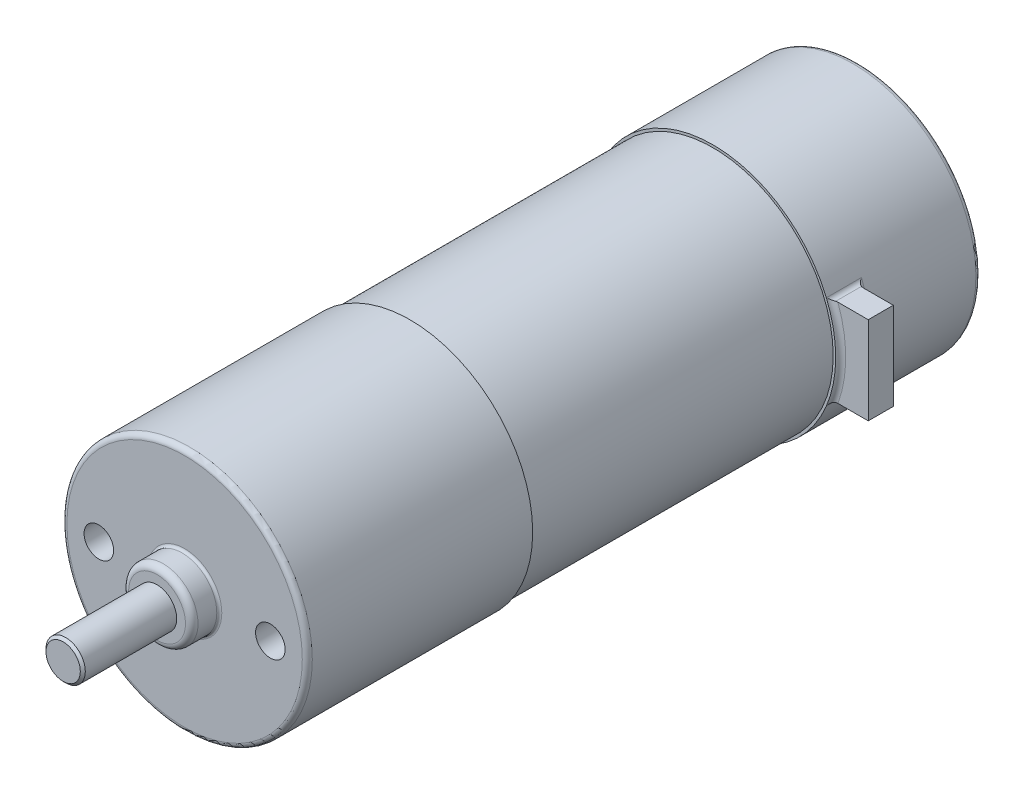
ISO-10303-21;
HEADER;
FILE_DESCRIPTION(('STEP AP214'),'2;1');
FILE_NAME('part.step','',(''),(''),'','','');
FILE_SCHEMA(('AUTOMOTIVE_DESIGN { 1 0 10303 214 1 1 1 1 }'));
ENDSEC;
DATA;
#1=APPLICATION_CONTEXT('core data for automotive mechanical design processes');
#2=APPLICATION_PROTOCOL_DEFINITION('international standard','automotive_design',2000,#1);
#3=PRODUCT_CONTEXT('',#1,'mechanical');
#4=PRODUCT('Part','Part','',(#3));
#5=PRODUCT_RELATED_PRODUCT_CATEGORY('part','',(#4));
#6=PRODUCT_DEFINITION_FORMATION('','',#4);
#7=PRODUCT_DEFINITION_CONTEXT('part definition',#1,'design');
#8=PRODUCT_DEFINITION('design','',#6,#7);
#9=PRODUCT_DEFINITION_SHAPE('','',#8);
#10=(LENGTH_UNIT() NAMED_UNIT(*) SI_UNIT(.MILLI.,.METRE.));
#11=(NAMED_UNIT(*) PLANE_ANGLE_UNIT() SI_UNIT($,.RADIAN.));
#12=(NAMED_UNIT(*) SI_UNIT($,.STERADIAN.) SOLID_ANGLE_UNIT());
#13=UNCERTAINTY_MEASURE_WITH_UNIT(LENGTH_MEASURE(1.E-05),#10,'distance_accuracy_value','');
#14=(GEOMETRIC_REPRESENTATION_CONTEXT(3) GLOBAL_UNCERTAINTY_ASSIGNED_CONTEXT((#13)) GLOBAL_UNIT_ASSIGNED_CONTEXT((#10,
#11,#12)) REPRESENTATION_CONTEXT('',''));
#15=CARTESIAN_POINT('',(0.,0.,0.));
#16=DIRECTION('',(0.,0.,1.));
#17=DIRECTION('',(1.,0.,0.));
#18=AXIS2_PLACEMENT_3D('',#15,#16,#17);
#19=CARTESIAN_POINT('',(0.,0.,-68.326));
#20=DIRECTION('',(0.,0.,1.));
#21=DIRECTION('',(-1.,0.,0.));
#22=AXIS2_PLACEMENT_3D('',#19,#20,#21);
#23=CYLINDRICAL_SURFACE('',#22,12.446);
#24=CARTESIAN_POINT('',(0.,0.,-53.594));
#25=DIRECTION('',(0.,0.,1.));
#26=DIRECTION('',(1.,0.,0.));
#27=AXIS2_PLACEMENT_3D('',#24,#25,#26);
#28=CIRCLE('',#27,12.446);
#29=CARTESIAN_POINT('',(11.5003075817149,4.75876470588235,-53.594));
#30=VERTEX_POINT('',#29);
#31=CARTESIAN_POINT('',(11.5003075817149,-4.75876470588235,-53.594));
#32=VERTEX_POINT('',#31);
#33=EDGE_CURVE('E163',#30,#32,#28,.T.);
#34=ORIENTED_EDGE('',*,*,#33,.F.);
#35=DIRECTION('',(0.,0.,1.));
#36=VECTOR('',#35,1.);
#37=CARTESIAN_POINT('',(11.5003075817149,4.75876470588235,-68.326));
#38=LINE('',#37,#36);
#39=CARTESIAN_POINT('',(11.5003075817149,4.75876470588235,-57.15));
#40=VERTEX_POINT('',#39);
#41=EDGE_CURVE('E213',#40,#30,#38,.T.);
#42=ORIENTED_EDGE('',*,*,#41,.F.);
#43=CARTESIAN_POINT('',(0.,0.,-57.15));
#44=DIRECTION('',(0.,0.,-1.));
#45=DIRECTION('',(-1.,0.,0.));
#46=AXIS2_PLACEMENT_3D('',#43,#44,#45);
#47=CIRCLE('',#46,12.446);
#48=CARTESIAN_POINT('',(11.5003075817149,-4.75876470588235,-57.15));
#49=VERTEX_POINT('',#48);
#50=EDGE_CURVE('E211',#49,#40,#47,.F.);
#51=ORIENTED_EDGE('',*,*,#50,.F.);
#52=DIRECTION('',(0.,0.,1.));
#53=VECTOR('',#52,1.);
#54=CARTESIAN_POINT('',(11.5003075817149,-4.75876470588235,-68.326));
#55=LINE('',#54,#53);
#56=EDGE_CURVE('E215',#32,#49,#55,.F.);
#57=ORIENTED_EDGE('',*,*,#56,.F.);
#58=EDGE_LOOP('',(#34,#42,#51,#57));
#59=FACE_BOUND('',#58,.T.);
#60=CARTESIAN_POINT('',(0.,0.,-67.818));
#61=DIRECTION('',(0.,0.,1.));
#62=DIRECTION('',(1.,0.,0.));
#63=AXIS2_PLACEMENT_3D('',#60,#61,#62);
#64=CIRCLE('',#63,12.446);
#65=CARTESIAN_POINT('',(12.446,0.,-67.818));
#66=VERTEX_POINT('',#65);
#67=EDGE_CURVE('E199',#66,#66,#64,.F.);
#68=ORIENTED_EDGE('',*,*,#67,.F.);
#69=EDGE_LOOP('',(#68));
#70=FACE_BOUND('',#69,.T.);
#71=ADVANCED_FACE('F45',(#59,#70),#23,.T.);
#72=CARTESIAN_POINT('',(0.,0.,-22.86));
#73=DIRECTION('',(0.,0.,1.));
#74=DIRECTION('',(-1.,0.,0.));
#75=AXIS2_PLACEMENT_3D('',#72,#73,#74);
#76=CYLINDRICAL_SURFACE('',#75,12.446);
#77=CARTESIAN_POINT('',(0.,0.,-0.508000000000002));
#78=DIRECTION('',(0.,0.,1.));
#79=DIRECTION('',(1.,0.,0.));
#80=AXIS2_PLACEMENT_3D('',#77,#78,#79);
#81=CIRCLE('',#80,12.446);
#82=CARTESIAN_POINT('',(12.446,0.,-0.508000000000002));
#83=VERTEX_POINT('',#82);
#84=EDGE_CURVE('E202',#83,#83,#81,.T.);
#85=ORIENTED_EDGE('',*,*,#84,.F.);
#86=EDGE_LOOP('',(#85));
#87=FACE_BOUND('',#86,.T.);
#88=CARTESIAN_POINT('',(0.,0.,-22.86));
#89=DIRECTION('',(0.,0.,1.));
#90=DIRECTION('',(1.,0.,0.));
#91=AXIS2_PLACEMENT_3D('',#88,#89,#90);
#92=CIRCLE('',#91,12.446);
#93=CARTESIAN_POINT('',(12.446,0.,-22.86));
#94=VERTEX_POINT('',#93);
#95=EDGE_CURVE('E170',#94,#94,#92,.T.);
#96=ORIENTED_EDGE('',*,*,#95,.T.);
#97=EDGE_LOOP('',(#96));
#98=FACE_BOUND('',#97,.T.);
#99=ADVANCED_FACE('F305',(#87,#98),#76,.T.);
#100=CARTESIAN_POINT('',(0.,0.,-22.86));
#101=DIRECTION('',(0.,0.,-1.));
#102=DIRECTION('',(1.,0.,0.));
#103=AXIS2_PLACEMENT_3D('',#100,#101,#102);
#104=PLANE('',#103);
#105=CARTESIAN_POINT('',(0.,0.,-22.86));
#106=DIRECTION('',(0.,0.,1.));
#107=DIRECTION('',(1.,0.,0.));
#108=AXIS2_PLACEMENT_3D('',#105,#106,#107);
#109=CIRCLE('',#108,12.192);
#110=CARTESIAN_POINT('',(12.192,0.,-22.86));
#111=VERTEX_POINT('',#110);
#112=EDGE_CURVE('E171',#111,#111,#109,.T.);
#113=ORIENTED_EDGE('',*,*,#112,.T.);
#114=EDGE_LOOP('',(#113));
#115=FACE_BOUND('',#114,.T.);
#116=ORIENTED_EDGE('',*,*,#95,.F.);
#117=EDGE_LOOP('',(#116));
#118=FACE_BOUND('',#117,.T.);
#119=ADVANCED_FACE('F311',(#115,#118),#104,.T.);
#120=CARTESIAN_POINT('',(0.,0.,0.));
#121=DIRECTION('',(0.,0.,-1.));
#122=DIRECTION('',(1.,0.,0.));
#123=AXIS2_PLACEMENT_3D('',#120,#121,#122);
#124=PLANE('',#123);
#125=CARTESIAN_POINT('',(8.6995,0.,0.));
#126=DIRECTION('',(0.,0.,-1.));
#127=DIRECTION('',(-1.,0.,0.));
#128=AXIS2_PLACEMENT_3D('',#125,#126,#127);
#129=CIRCLE('',#128,1.5);
#130=CARTESIAN_POINT('',(7.1995,0.,0.));
#131=VERTEX_POINT('',#130);
#132=EDGE_CURVE('E155',#131,#131,#129,.T.);
#133=ORIENTED_EDGE('',*,*,#132,.T.);
#134=EDGE_LOOP('',(#133));
#135=FACE_BOUND('',#134,.T.);
#136=CARTESIAN_POINT('',(-8.6995,0.,0.));
#137=DIRECTION('',(0.,0.,-1.));
#138=DIRECTION('',(1.,0.,0.));
#139=AXIS2_PLACEMENT_3D('',#136,#137,#138);
#140=CIRCLE('',#139,1.5);
#141=CARTESIAN_POINT('',(-10.1995,0.,0.));
#142=VERTEX_POINT('',#141);
#143=EDGE_CURVE('E158',#142,#142,#140,.T.);
#144=ORIENTED_EDGE('',*,*,#143,.T.);
#145=EDGE_LOOP('',(#144));
#146=FACE_BOUND('',#145,.T.);
#147=CARTESIAN_POINT('',(0.,0.,0.));
#148=DIRECTION('',(0.,0.,1.));
#149=DIRECTION('',(1.,0.,0.));
#150=AXIS2_PLACEMENT_3D('',#147,#148,#149);
#151=CIRCLE('',#150,11.938);
#152=CARTESIAN_POINT('',(11.938,0.,0.));
#153=VERTEX_POINT('',#152);
#154=EDGE_CURVE('E205',#153,#153,#151,.F.);
#155=ORIENTED_EDGE('',*,*,#154,.F.);
#156=EDGE_LOOP('',(#155));
#157=FACE_BOUND('',#156,.T.);
#158=CARTESIAN_POINT('',(0.,0.,0.));
#159=DIRECTION('',(0.,0.,1.));
#160=DIRECTION('',(1.,0.,0.));
#161=AXIS2_PLACEMENT_3D('',#158,#159,#160);
#162=CIRCLE('',#161,3.7719);
#163=CARTESIAN_POINT('',(3.7719,0.,0.));
#164=VERTEX_POINT('',#163);
#165=EDGE_CURVE('E193',#164,#164,#162,.T.);
#166=ORIENTED_EDGE('',*,*,#165,.F.);
#167=EDGE_LOOP('',(#166));
#168=FACE_BOUND('',#167,.T.);
#169=ADVANCED_FACE('F324',(#135,#146,#157,#168),#124,.F.);
#170=CARTESIAN_POINT('',(0.,0.,-53.594));
#171=DIRECTION('',(0.,0.,1.));
#172=DIRECTION('',(-1.,0.,0.));
#173=AXIS2_PLACEMENT_3D('',#170,#171,#172);
#174=CYLINDRICAL_SURFACE('',#173,12.192);
#175=CARTESIAN_POINT('',(0.,0.,-53.594));
#176=DIRECTION('',(0.,0.,1.));
#177=DIRECTION('',(1.,0.,0.));
#178=AXIS2_PLACEMENT_3D('',#175,#176,#177);
#179=CIRCLE('',#178,12.192);
#180=CARTESIAN_POINT('',(12.192,0.,-53.594));
#181=VERTEX_POINT('',#180);
#182=EDGE_CURVE('E166',#181,#181,#179,.T.);
#183=ORIENTED_EDGE('',*,*,#182,.T.);
#184=EDGE_LOOP('',(#183));
#185=FACE_BOUND('',#184,.T.);
#186=ORIENTED_EDGE('',*,*,#112,.F.);
#187=EDGE_LOOP('',(#186));
#188=FACE_BOUND('',#187,.T.);
#189=ADVANCED_FACE('F320',(#185,#188),#174,.T.);
#190=CARTESIAN_POINT('',(0.,0.,-68.326));
#191=DIRECTION('',(0.,0.,-1.));
#192=DIRECTION('',(1.,0.,0.));
#193=AXIS2_PLACEMENT_3D('',#190,#191,#192);
#194=PLANE('',#193);
#195=CARTESIAN_POINT('',(0.,0.,-68.326));
#196=DIRECTION('',(0.,0.,1.));
#197=DIRECTION('',(1.,0.,0.));
#198=AXIS2_PLACEMENT_3D('',#195,#196,#197);
#199=CIRCLE('',#198,11.938);
#200=CARTESIAN_POINT('',(11.938,0.,-68.326));
#201=VERTEX_POINT('',#200);
#202=EDGE_CURVE('E196',#201,#201,#199,.T.);
#203=ORIENTED_EDGE('',*,*,#202,.F.);
#204=EDGE_LOOP('',(#203));
#205=FACE_BOUND('',#204,.T.);
#206=ADVANCED_FACE('F323',(#205),#194,.T.);
#207=CARTESIAN_POINT('',(0.,0.,-53.594));
#208=DIRECTION('',(0.,0.,-1.));
#209=DIRECTION('',(1.,0.,0.));
#210=AXIS2_PLACEMENT_3D('',#207,#208,#209);
#211=PLANE('',#210);
#212=ORIENTED_EDGE('',*,*,#182,.F.);
#213=EDGE_LOOP('',(#212));
#214=FACE_BOUND('',#213,.T.);
#215=ORIENTED_EDGE('',*,*,#33,.T.);
#216=EDGE_CURVE('E167',#32,#30,#28,.T.);
#217=ORIENTED_EDGE('',*,*,#216,.T.);
#218=EDGE_LOOP('',(#215,#217));
#219=FACE_BOUND('',#218,.T.);
#220=ADVANCED_FACE('F318',(#214,#219),#211,.F.);
#221=CARTESIAN_POINT('',(0.,0.,2.794));
#222=DIRECTION('',(0.,0.,-1.));
#223=DIRECTION('',(1.,0.,0.));
#224=AXIS2_PLACEMENT_3D('',#221,#222,#223);
#225=CYLINDRICAL_SURFACE('',#224,3.5179);
#226=CARTESIAN_POINT('',(0.,0.,0.254));
#227=DIRECTION('',(0.,0.,1.));
#228=DIRECTION('',(1.,0.,0.));
#229=AXIS2_PLACEMENT_3D('',#226,#227,#228);
#230=CIRCLE('',#229,3.5179);
#231=CARTESIAN_POINT('',(3.5179,0.,0.254));
#232=VERTEX_POINT('',#231);
#233=EDGE_CURVE('E190',#232,#232,#230,.F.);
#234=ORIENTED_EDGE('',*,*,#233,.F.);
#235=EDGE_LOOP('',(#234));
#236=FACE_BOUND('',#235,.T.);
#237=CARTESIAN_POINT('',(0.,0.,2.159));
#238=DIRECTION('',(0.,0.,-1.));
#239=DIRECTION('',(-1.,0.,0.));
#240=AXIS2_PLACEMENT_3D('',#237,#238,#239);
#241=CIRCLE('',#240,3.5179);
#242=CARTESIAN_POINT('',(-3.5179,0.,2.159));
#243=VERTEX_POINT('',#242);
#244=EDGE_CURVE('E187',#243,#243,#241,.F.);
#245=ORIENTED_EDGE('',*,*,#244,.F.);
#246=EDGE_LOOP('',(#245));
#247=FACE_BOUND('',#246,.T.);
#248=ADVANCED_FACE('F370',(#236,#247),#225,.T.);
#249=CARTESIAN_POINT('',(0.,0.,2.794));
#250=DIRECTION('',(0.,0.,1.));
#251=DIRECTION('',(-1.,0.,0.));
#252=AXIS2_PLACEMENT_3D('',#249,#250,#251);
#253=PLANE('',#252);
#254=CARTESIAN_POINT('',(0.,0.,2.794));
#255=DIRECTION('',(0.,0.,-1.));
#256=DIRECTION('',(-1.,0.,0.));
#257=AXIS2_PLACEMENT_3D('',#254,#255,#256);
#258=CIRCLE('',#257,2.8829);
#259=CARTESIAN_POINT('',(-2.8829,0.,2.794));
#260=VERTEX_POINT('',#259);
#261=EDGE_CURVE('E184',#260,#260,#258,.T.);
#262=ORIENTED_EDGE('',*,*,#261,.F.);
#263=EDGE_LOOP('',(#262));
#264=FACE_BOUND('',#263,.T.);
#265=CARTESIAN_POINT('',(0.,0.,2.794));
#266=DIRECTION('',(0.,0.,-1.));
#267=DIRECTION('',(-1.,0.,0.));
#268=AXIS2_PLACEMENT_3D('',#265,#266,#267);
#269=CIRCLE('',#268,1.9939);
#270=CARTESIAN_POINT('',(1.9939,0.,2.794));
#271=VERTEX_POINT('',#270);
#272=EDGE_CURVE('E154',#271,#271,#269,.F.);
#273=ORIENTED_EDGE('',*,*,#272,.F.);
#274=EDGE_LOOP('',(#273));
#275=FACE_BOUND('',#274,.T.);
#276=ADVANCED_FACE('F373',(#264,#275),#253,.T.);
#277=CARTESIAN_POINT('',(0.,0.,12.319));
#278=DIRECTION('',(0.,0.,-1.));
#279=DIRECTION('',(1.,0.,0.));
#280=AXIS2_PLACEMENT_3D('',#277,#278,#279);
#281=CYLINDRICAL_SURFACE('',#280,1.9939);
#282=CARTESIAN_POINT('',(0.,0.,12.065));
#283=DIRECTION('',(0.,0.,-1.));
#284=DIRECTION('',(-1.,0.,0.));
#285=AXIS2_PLACEMENT_3D('',#282,#283,#284);
#286=CIRCLE('',#285,1.9939);
#287=CARTESIAN_POINT('',(1.9939,0.,12.065));
#288=VERTEX_POINT('',#287);
#289=EDGE_CURVE('E181',#288,#288,#286,.F.);
#290=CARTESIAN_POINT('',(1.9939,0.,12.065));
#291=CARTESIAN_POINT('',(1.9939,0.,11.9684270833334));
#292=CARTESIAN_POINT('',(1.9939,0.,11.8718541666667));
#293=CARTESIAN_POINT('',(1.9939,0.,11.6787083333334));
#294=CARTESIAN_POINT('',(1.9939,0.,11.5821354166667));
#295=CARTESIAN_POINT('',(1.9939,0.,11.3889895833334));
#296=CARTESIAN_POINT('',(1.9939,0.,11.2924166666667));
#297=CARTESIAN_POINT('',(1.9939,0.,11.0992708333334));
#298=CARTESIAN_POINT('',(1.9939,0.,11.0026979166667));
#299=CARTESIAN_POINT('',(1.9939,0.,10.8095520833334));
#300=CARTESIAN_POINT('',(1.9939,0.,10.7129791666667));
#301=CARTESIAN_POINT('',(1.9939,0.,10.5198333333334));
#302=CARTESIAN_POINT('',(1.9939,0.,10.4232604166667));
#303=CARTESIAN_POINT('',(1.9939,0.,10.2301145833334));
#304=CARTESIAN_POINT('',(1.9939,0.,10.1335416666667));
#305=CARTESIAN_POINT('',(1.9939,0.,9.94039583333335));
#306=CARTESIAN_POINT('',(1.9939,0.,9.84382291666669));
#307=CARTESIAN_POINT('',(1.9939,0.,9.65067708333335));
#308=CARTESIAN_POINT('',(1.9939,0.,9.55410416666668));
#309=CARTESIAN_POINT('',(1.9939,0.,9.36095833333335));
#310=CARTESIAN_POINT('',(1.9939,0.,9.26438541666668));
#311=CARTESIAN_POINT('',(1.9939,0.,9.07123958333335));
#312=CARTESIAN_POINT('',(1.9939,0.,8.97466666666668));
#313=CARTESIAN_POINT('',(1.9939,0.,8.78152083333335));
#314=CARTESIAN_POINT('',(1.9939,0.,8.68494791666668));
#315=CARTESIAN_POINT('',(1.9939,0.,8.49180208333335));
#316=CARTESIAN_POINT('',(1.9939,0.,8.39522916666668));
#317=CARTESIAN_POINT('',(1.9939,0.,8.20208333333335));
#318=CARTESIAN_POINT('',(1.9939,0.,8.10551041666668));
#319=CARTESIAN_POINT('',(1.9939,0.,7.91236458333335));
#320=CARTESIAN_POINT('',(1.9939,0.,7.81579166666668));
#321=CARTESIAN_POINT('',(1.9939,0.,7.62264583333335));
#322=CARTESIAN_POINT('',(1.9939,0.,7.52607291666668));
#323=CARTESIAN_POINT('',(1.9939,0.,7.33292708333335));
#324=CARTESIAN_POINT('',(1.9939,0.,7.23635416666668));
#325=CARTESIAN_POINT('',(1.9939,0.,7.04320833333334));
#326=CARTESIAN_POINT('',(1.9939,0.,6.94663541666668));
#327=CARTESIAN_POINT('',(1.9939,0.,6.75348958333334));
#328=CARTESIAN_POINT('',(1.9939,0.,6.65691666666668));
#329=CARTESIAN_POINT('',(1.9939,0.,6.46377083333334));
#330=CARTESIAN_POINT('',(1.9939,0.,6.36719791666668));
#331=CARTESIAN_POINT('',(1.9939,0.,6.17405208333334));
#332=CARTESIAN_POINT('',(1.9939,0.,6.07747916666668));
#333=CARTESIAN_POINT('',(1.9939,0.,5.88433333333334));
#334=CARTESIAN_POINT('',(1.9939,0.,5.78776041666667));
#335=CARTESIAN_POINT('',(1.9939,0.,5.59461458333334));
#336=CARTESIAN_POINT('',(1.9939,0.,5.49804166666667));
#337=CARTESIAN_POINT('',(1.9939,0.,5.30489583333334));
#338=CARTESIAN_POINT('',(1.9939,0.,5.20832291666667));
#339=CARTESIAN_POINT('',(1.9939,0.,5.01517708333334));
#340=CARTESIAN_POINT('',(1.9939,0.,4.91860416666667));
#341=CARTESIAN_POINT('',(1.9939,0.,4.72545833333334));
#342=CARTESIAN_POINT('',(1.9939,0.,4.62888541666667));
#343=CARTESIAN_POINT('',(1.9939,0.,4.43573958333334));
#344=CARTESIAN_POINT('',(1.9939,0.,4.33916666666667));
#345=CARTESIAN_POINT('',(1.9939,0.,4.14602083333334));
#346=CARTESIAN_POINT('',(1.9939,0.,4.04944791666667));
#347=CARTESIAN_POINT('',(1.9939,0.,3.85630208333334));
#348=CARTESIAN_POINT('',(1.9939,0.,3.75972916666667));
#349=CARTESIAN_POINT('',(1.9939,0.,3.56658333333334));
#350=CARTESIAN_POINT('',(1.9939,0.,3.47001041666667));
#351=CARTESIAN_POINT('',(1.9939,0.,3.27686458333333));
#352=CARTESIAN_POINT('',(1.9939,0.,3.18029166666667));
#353=CARTESIAN_POINT('',(1.9939,0.,2.98714583333333));
#354=CARTESIAN_POINT('',(1.9939,0.,2.89057291666667));
#355=CARTESIAN_POINT('',(1.9939,0.,2.794));
#356=B_SPLINE_CURVE_WITH_KNOTS('',3,(#290,#291,#292,#293,#294,#295,#296,#297,#298,#299,#300,
#301,#302,#303,#304,#305,#306,#307,#308,#309,#310,#311,#312,#313,#314,#315,#316,#317,#318,#319,
#320,#321,#322,#323,#324,#325,#326,#327,#328,#329,#330,#331,#332,#333,#334,#335,#336,#337,#338,
#339,#340,#341,#342,#343,#344,#345,#346,#347,#348,#349,#350,#351,#352,#353,#354,#355),
.UNSPECIFIED.,.F.,.F.,(4,2,2,2,2,2,2,2,2,2,2,2,2,2,2,2,2,2,2,2,2,2,2,2,2,2,2,2,2,2,2,2,4),(0.,
0.289718750000001,0.579437500000002,0.869156250000003,1.158875,1.44859375,1.73831250000001,
2.02803125000001,2.31775000000001,2.60746875000001,2.89718750000001,3.18690625000001,
3.47662500000001,3.76634375000001,4.05606250000001,4.34578125000001,4.63550000000001,
4.92521875000001,5.21493750000001,5.50465625000002,5.79437500000002,6.08409375000002,
6.37381250000002,6.66353125000002,6.95325000000002,7.24296875000002,7.53268750000002,
7.82240625000002,8.11212500000002,8.40184375000002,8.69156250000002,8.98128125000003,
9.27100000000003),.UNSPECIFIED.);
#357=EDGE_CURVE('BSEAM381',#288,#271,#356,.T.);
#358=ORIENTED_EDGE('',*,*,#289,.F.);
#359=ORIENTED_EDGE('',*,*,#272,.T.);
#360=ORIENTED_EDGE('',*,*,#357,.T.);
#361=ORIENTED_EDGE('',*,*,#357,.F.);
#362=EDGE_LOOP('',(#358,#360,#359,#361));
#363=FACE_BOUND('',#362,.T.);
#364=ADVANCED_FACE('F381',(#363),#281,.T.);
#365=CARTESIAN_POINT('',(0.,0.,12.319));
#366=DIRECTION('',(0.,0.,1.));
#367=DIRECTION('',(-1.,0.,0.));
#368=AXIS2_PLACEMENT_3D('',#365,#366,#367);
#369=PLANE('',#368);
#370=CARTESIAN_POINT('',(0.,0.,12.319));
#371=DIRECTION('',(0.,0.,-1.));
#372=DIRECTION('',(-1.,0.,0.));
#373=AXIS2_PLACEMENT_3D('',#370,#371,#372);
#374=CIRCLE('',#373,1.73990000000003);
#375=CARTESIAN_POINT('',(-1.73990000000003,0.,12.319));
#376=VERTEX_POINT('',#375);
#377=EDGE_CURVE('E174',#376,#376,#374,.T.);
#378=ORIENTED_EDGE('',*,*,#377,.F.);
#379=EDGE_LOOP('',(#378));
#380=FACE_BOUND('',#379,.T.);
#381=ADVANCED_FACE('F336',(#380),#369,.T.);
#382=CARTESIAN_POINT('',(0.,0.,12.319));
#383=DIRECTION('',(0.,0.,-1.));
#384=DIRECTION('',(1.,0.,0.));
#385=AXIS2_PLACEMENT_3D('',#382,#383,#384);
#386=CONICAL_SURFACE('',#385,1.73990000000003,0.785398163397436);
#387=ORIENTED_EDGE('',*,*,#289,.T.);
#388=EDGE_LOOP('',(#387));
#389=FACE_BOUND('',#388,.T.);
#390=ORIENTED_EDGE('',*,*,#377,.T.);
#391=EDGE_LOOP('',(#390));
#392=FACE_BOUND('',#391,.T.);
#393=ADVANCED_FACE('F332',(#389,#392),#386,.T.);
#394=CARTESIAN_POINT('',(0.,0.,2.159));
#395=DIRECTION('',(0.,0.,1.));
#396=DIRECTION('',(-1.,0.,0.));
#397=AXIS2_PLACEMENT_3D('',#394,#395,#396);
#398=TOROIDAL_SURFACE('',#397,2.8829,0.635);
#399=ORIENTED_EDGE('',*,*,#244,.T.);
#400=EDGE_LOOP('',(#399));
#401=FACE_BOUND('',#400,.T.);
#402=ORIENTED_EDGE('',*,*,#261,.T.);
#403=EDGE_LOOP('',(#402));
#404=FACE_BOUND('',#403,.T.);
#405=ADVANCED_FACE('F335',(#401,#404),#398,.T.);
#406=CARTESIAN_POINT('',(0.,0.,0.254));
#407=DIRECTION('',(0.,0.,-1.));
#408=DIRECTION('',(1.,0.,0.));
#409=AXIS2_PLACEMENT_3D('',#406,#407,#408);
#410=TOROIDAL_SURFACE('',#409,3.7719,0.254);
#411=ORIENTED_EDGE('',*,*,#165,.T.);
#412=EDGE_LOOP('',(#411));
#413=FACE_BOUND('',#412,.T.);
#414=ORIENTED_EDGE('',*,*,#233,.T.);
#415=EDGE_LOOP('',(#414));
#416=FACE_BOUND('',#415,.T.);
#417=ADVANCED_FACE('F340',(#413,#416),#410,.F.);
#418=CARTESIAN_POINT('',(0.,0.,-67.818));
#419=DIRECTION('',(0.,0.,-1.));
#420=DIRECTION('',(1.,0.,0.));
#421=AXIS2_PLACEMENT_3D('',#418,#419,#420);
#422=TOROIDAL_SURFACE('',#421,11.938,0.508);
#423=ORIENTED_EDGE('',*,*,#67,.T.);
#424=EDGE_LOOP('',(#423));
#425=FACE_BOUND('',#424,.T.);
#426=ORIENTED_EDGE('',*,*,#202,.T.);
#427=EDGE_LOOP('',(#426));
#428=FACE_BOUND('',#427,.T.);
#429=ADVANCED_FACE('F344',(#425,#428),#422,.T.);
#430=CARTESIAN_POINT('',(0.,0.,-0.508000000000002));
#431=DIRECTION('',(0.,0.,-1.));
#432=DIRECTION('',(1.,0.,0.));
#433=AXIS2_PLACEMENT_3D('',#430,#431,#432);
#434=TOROIDAL_SURFACE('',#433,11.938,0.508);
#435=ORIENTED_EDGE('',*,*,#154,.T.);
#436=EDGE_LOOP('',(#435));
#437=FACE_BOUND('',#436,.T.);
#438=ORIENTED_EDGE('',*,*,#84,.T.);
#439=EDGE_LOOP('',(#438));
#440=FACE_BOUND('',#439,.T.);
#441=ADVANCED_FACE('F347',(#437,#440),#434,.T.);
#442=CARTESIAN_POINT('',(-8.6995,0.,-7.62));
#443=DIRECTION('',(0.,0.,1.));
#444=DIRECTION('',(-1.,0.,0.));
#445=AXIS2_PLACEMENT_3D('',#442,#443,#444);
#446=CYLINDRICAL_SURFACE('',#445,1.5);
#447=CARTESIAN_POINT('',(-8.6995,0.,-7.62));
#448=DIRECTION('',(0.,0.,-1.));
#449=DIRECTION('',(1.,0.,0.));
#450=AXIS2_PLACEMENT_3D('',#447,#448,#449);
#451=CIRCLE('',#450,1.5);
#452=CARTESIAN_POINT('',(-10.1995,0.,-7.62));
#453=VERTEX_POINT('',#452);
#454=EDGE_CURVE('E134',#453,#453,#451,.T.);
#455=CARTESIAN_POINT('',(-10.1995,0.,-7.62));
#456=CARTESIAN_POINT('',(-10.1995,0.,-7.540625));
#457=CARTESIAN_POINT('',(-10.1995,0.,-7.46125));
#458=CARTESIAN_POINT('',(-10.1995,0.,-7.3025));
#459=CARTESIAN_POINT('',(-10.1995,0.,-7.223125));
#460=CARTESIAN_POINT('',(-10.1995,0.,-7.064375));
#461=CARTESIAN_POINT('',(-10.1995,0.,-6.985));
#462=CARTESIAN_POINT('',(-10.1995,0.,-6.82625));
#463=CARTESIAN_POINT('',(-10.1995,0.,-6.746875));
#464=CARTESIAN_POINT('',(-10.1995,0.,-6.588125));
#465=CARTESIAN_POINT('',(-10.1995,0.,-6.50875));
#466=CARTESIAN_POINT('',(-10.1995,0.,-6.35));
#467=CARTESIAN_POINT('',(-10.1995,0.,-6.270625));
#468=CARTESIAN_POINT('',(-10.1995,0.,-6.111875));
#469=CARTESIAN_POINT('',(-10.1995,0.,-6.0325));
#470=CARTESIAN_POINT('',(-10.1995,0.,-5.87375));
#471=CARTESIAN_POINT('',(-10.1995,0.,-5.794375));
#472=CARTESIAN_POINT('',(-10.1995,0.,-5.635625));
#473=CARTESIAN_POINT('',(-10.1995,0.,-5.55625));
#474=CARTESIAN_POINT('',(-10.1995,0.,-5.3975));
#475=CARTESIAN_POINT('',(-10.1995,0.,-5.318125));
#476=CARTESIAN_POINT('',(-10.1995,0.,-5.159375));
#477=CARTESIAN_POINT('',(-10.1995,0.,-5.08));
#478=CARTESIAN_POINT('',(-10.1995,0.,-4.92125));
#479=CARTESIAN_POINT('',(-10.1995,0.,-4.841875));
#480=CARTESIAN_POINT('',(-10.1995,0.,-4.683125));
#481=CARTESIAN_POINT('',(-10.1995,0.,-4.60375));
#482=CARTESIAN_POINT('',(-10.1995,0.,-4.445));
#483=CARTESIAN_POINT('',(-10.1995,0.,-4.365625));
#484=CARTESIAN_POINT('',(-10.1995,0.,-4.206875));
#485=CARTESIAN_POINT('',(-10.1995,0.,-4.1275));
#486=CARTESIAN_POINT('',(-10.1995,0.,-3.96875));
#487=CARTESIAN_POINT('',(-10.1995,0.,-3.889375));
#488=CARTESIAN_POINT('',(-10.1995,0.,-3.730625));
#489=CARTESIAN_POINT('',(-10.1995,0.,-3.65125));
#490=CARTESIAN_POINT('',(-10.1995,0.,-3.4925));
#491=CARTESIAN_POINT('',(-10.1995,0.,-3.413125));
#492=CARTESIAN_POINT('',(-10.1995,0.,-3.254375));
#493=CARTESIAN_POINT('',(-10.1995,0.,-3.175));
#494=CARTESIAN_POINT('',(-10.1995,0.,-3.01625));
#495=CARTESIAN_POINT('',(-10.1995,0.,-2.936875));
#496=CARTESIAN_POINT('',(-10.1995,0.,-2.778125));
#497=CARTESIAN_POINT('',(-10.1995,0.,-2.69875));
#498=CARTESIAN_POINT('',(-10.1995,0.,-2.54));
#499=CARTESIAN_POINT('',(-10.1995,0.,-2.460625));
#500=CARTESIAN_POINT('',(-10.1995,0.,-2.301875));
#501=CARTESIAN_POINT('',(-10.1995,0.,-2.2225));
#502=CARTESIAN_POINT('',(-10.1995,0.,-2.06375));
#503=CARTESIAN_POINT('',(-10.1995,0.,-1.984375));
#504=CARTESIAN_POINT('',(-10.1995,0.,-1.825625));
#505=CARTESIAN_POINT('',(-10.1995,0.,-1.74625));
#506=CARTESIAN_POINT('',(-10.1995,0.,-1.5875));
#507=CARTESIAN_POINT('',(-10.1995,0.,-1.508125));
#508=CARTESIAN_POINT('',(-10.1995,0.,-1.349375));
#509=CARTESIAN_POINT('',(-10.1995,0.,-1.27));
#510=CARTESIAN_POINT('',(-10.1995,0.,-1.11125));
#511=CARTESIAN_POINT('',(-10.1995,0.,-1.031875));
#512=CARTESIAN_POINT('',(-10.1995,0.,-0.873125));
#513=CARTESIAN_POINT('',(-10.1995,0.,-0.79375));
#514=CARTESIAN_POINT('',(-10.1995,0.,-0.635));
#515=CARTESIAN_POINT('',(-10.1995,0.,-0.555625));
#516=CARTESIAN_POINT('',(-10.1995,0.,-0.396875));
#517=CARTESIAN_POINT('',(-10.1995,0.,-0.3175));
#518=CARTESIAN_POINT('',(-10.1995,0.,-0.15875));
#519=CARTESIAN_POINT('',(-10.1995,0.,-0.0793749999999999));
#520=CARTESIAN_POINT('',(-10.1995,0.,0.));
#521=B_SPLINE_CURVE_WITH_KNOTS('',3,(#455,#456,#457,#458,#459,#460,#461,#462,#463,#464,#465,
#466,#467,#468,#469,#470,#471,#472,#473,#474,#475,#476,#477,#478,#479,#480,#481,#482,#483,#484,
#485,#486,#487,#488,#489,#490,#491,#492,#493,#494,#495,#496,#497,#498,#499,#500,#501,#502,#503,
#504,#505,#506,#507,#508,#509,#510,#511,#512,#513,#514,#515,#516,#517,#518,#519,#520),
.UNSPECIFIED.,.F.,.F.,(4,2,2,2,2,2,2,2,2,2,2,2,2,2,2,2,2,2,2,2,2,2,2,2,2,2,2,2,2,2,2,2,4),(0.,
0.238125,0.476249999999999,0.714375,0.952499999999999,1.190625,1.42875,1.666875,1.905,2.143125,
2.38125,2.619375,2.8575,3.095625,3.33375,3.571875,3.81,4.048125,4.28625,4.524375,4.7625,
5.000625,5.23875,5.476875,5.715,5.953125,6.19125,6.429375,6.6675,6.905625,7.14375,7.381875,
7.62),.UNSPECIFIED.);
#522=EDGE_CURVE('BSEAM350',#453,#142,#521,.T.);
#523=ORIENTED_EDGE('',*,*,#454,.T.);
#524=ORIENTED_EDGE('',*,*,#143,.F.);
#525=ORIENTED_EDGE('',*,*,#522,.T.);
#526=ORIENTED_EDGE('',*,*,#522,.F.);
#527=EDGE_LOOP('',(#523,#525,#524,#526));
#528=FACE_BOUND('',#527,.T.);
#529=ADVANCED_FACE('F350',(#528),#446,.F.);
#530=CARTESIAN_POINT('',(-8.6995,0.,-7.62));
#531=DIRECTION('',(0.,0.,-1.));
#532=DIRECTION('',(1.,0.,0.));
#533=AXIS2_PLACEMENT_3D('',#530,#531,#532);
#534=PLANE('',#533);
#535=ORIENTED_EDGE('',*,*,#454,.F.);
#536=EDGE_LOOP('',(#535));
#537=FACE_BOUND('',#536,.T.);
#538=ADVANCED_FACE('F355',(#537),#534,.F.);
#539=CARTESIAN_POINT('',(8.6995,0.,-7.62));
#540=DIRECTION('',(0.,0.,1.));
#541=DIRECTION('',(-1.,0.,0.));
#542=AXIS2_PLACEMENT_3D('',#539,#540,#541);
#543=CYLINDRICAL_SURFACE('',#542,1.5);
#544=CARTESIAN_POINT('',(8.6995,0.,-7.62));
#545=DIRECTION('',(0.,0.,-1.));
#546=DIRECTION('',(-1.,0.,0.));
#547=AXIS2_PLACEMENT_3D('',#544,#545,#546);
#548=CIRCLE('',#547,1.5);
#549=CARTESIAN_POINT('',(7.1995,0.,-7.62));
#550=VERTEX_POINT('',#549);
#551=EDGE_CURVE('E151',#550,#550,#548,.T.);
#552=CARTESIAN_POINT('',(7.1995,0.,-7.62));
#553=CARTESIAN_POINT('',(7.1995,0.,-7.540625));
#554=CARTESIAN_POINT('',(7.1995,0.,-7.46125));
#555=CARTESIAN_POINT('',(7.1995,0.,-7.3025));
#556=CARTESIAN_POINT('',(7.1995,0.,-7.223125));
#557=CARTESIAN_POINT('',(7.1995,0.,-7.064375));
#558=CARTESIAN_POINT('',(7.1995,0.,-6.985));
#559=CARTESIAN_POINT('',(7.1995,0.,-6.82625));
#560=CARTESIAN_POINT('',(7.1995,0.,-6.746875));
#561=CARTESIAN_POINT('',(7.1995,0.,-6.588125));
#562=CARTESIAN_POINT('',(7.1995,0.,-6.50875));
#563=CARTESIAN_POINT('',(7.1995,0.,-6.35));
#564=CARTESIAN_POINT('',(7.1995,0.,-6.270625));
#565=CARTESIAN_POINT('',(7.1995,0.,-6.111875));
#566=CARTESIAN_POINT('',(7.1995,0.,-6.0325));
#567=CARTESIAN_POINT('',(7.1995,0.,-5.87375));
#568=CARTESIAN_POINT('',(7.1995,0.,-5.794375));
#569=CARTESIAN_POINT('',(7.1995,0.,-5.635625));
#570=CARTESIAN_POINT('',(7.1995,0.,-5.55625));
#571=CARTESIAN_POINT('',(7.1995,0.,-5.3975));
#572=CARTESIAN_POINT('',(7.1995,0.,-5.318125));
#573=CARTESIAN_POINT('',(7.1995,0.,-5.159375));
#574=CARTESIAN_POINT('',(7.1995,0.,-5.08));
#575=CARTESIAN_POINT('',(7.1995,0.,-4.92125));
#576=CARTESIAN_POINT('',(7.1995,0.,-4.841875));
#577=CARTESIAN_POINT('',(7.1995,0.,-4.683125));
#578=CARTESIAN_POINT('',(7.1995,0.,-4.60375));
#579=CARTESIAN_POINT('',(7.1995,0.,-4.445));
#580=CARTESIAN_POINT('',(7.1995,0.,-4.365625));
#581=CARTESIAN_POINT('',(7.1995,0.,-4.206875));
#582=CARTESIAN_POINT('',(7.1995,0.,-4.1275));
#583=CARTESIAN_POINT('',(7.1995,0.,-3.96875));
#584=CARTESIAN_POINT('',(7.1995,0.,-3.889375));
#585=CARTESIAN_POINT('',(7.1995,0.,-3.730625));
#586=CARTESIAN_POINT('',(7.1995,0.,-3.65125));
#587=CARTESIAN_POINT('',(7.1995,0.,-3.4925));
#588=CARTESIAN_POINT('',(7.1995,0.,-3.413125));
#589=CARTESIAN_POINT('',(7.1995,0.,-3.254375));
#590=CARTESIAN_POINT('',(7.1995,0.,-3.175));
#591=CARTESIAN_POINT('',(7.1995,0.,-3.01625));
#592=CARTESIAN_POINT('',(7.1995,0.,-2.936875));
#593=CARTESIAN_POINT('',(7.1995,0.,-2.778125));
#594=CARTESIAN_POINT('',(7.1995,0.,-2.69875));
#595=CARTESIAN_POINT('',(7.1995,0.,-2.54));
#596=CARTESIAN_POINT('',(7.1995,0.,-2.460625));
#597=CARTESIAN_POINT('',(7.1995,0.,-2.301875));
#598=CARTESIAN_POINT('',(7.1995,0.,-2.2225));
#599=CARTESIAN_POINT('',(7.1995,0.,-2.06375));
#600=CARTESIAN_POINT('',(7.1995,0.,-1.984375));
#601=CARTESIAN_POINT('',(7.1995,0.,-1.825625));
#602=CARTESIAN_POINT('',(7.1995,0.,-1.74625));
#603=CARTESIAN_POINT('',(7.1995,0.,-1.5875));
#604=CARTESIAN_POINT('',(7.1995,0.,-1.508125));
#605=CARTESIAN_POINT('',(7.1995,0.,-1.349375));
#606=CARTESIAN_POINT('',(7.1995,0.,-1.27));
#607=CARTESIAN_POINT('',(7.1995,0.,-1.11125));
#608=CARTESIAN_POINT('',(7.1995,0.,-1.031875));
#609=CARTESIAN_POINT('',(7.1995,0.,-0.873125));
#610=CARTESIAN_POINT('',(7.1995,0.,-0.79375));
#611=CARTESIAN_POINT('',(7.1995,0.,-0.635));
#612=CARTESIAN_POINT('',(7.1995,0.,-0.555625));
#613=CARTESIAN_POINT('',(7.1995,0.,-0.396875));
#614=CARTESIAN_POINT('',(7.1995,0.,-0.3175));
#615=CARTESIAN_POINT('',(7.1995,0.,-0.15875));
#616=CARTESIAN_POINT('',(7.1995,0.,-0.0793749999999999));
#617=CARTESIAN_POINT('',(7.1995,0.,0.));
#618=B_SPLINE_CURVE_WITH_KNOTS('',3,(#552,#553,#554,#555,#556,#557,#558,#559,#560,#561,#562,
#563,#564,#565,#566,#567,#568,#569,#570,#571,#572,#573,#574,#575,#576,#577,#578,#579,#580,#581,
#582,#583,#584,#585,#586,#587,#588,#589,#590,#591,#592,#593,#594,#595,#596,#597,#598,#599,#600,
#601,#602,#603,#604,#605,#606,#607,#608,#609,#610,#611,#612,#613,#614,#615,#616,#617),
.UNSPECIFIED.,.F.,.F.,(4,2,2,2,2,2,2,2,2,2,2,2,2,2,2,2,2,2,2,2,2,2,2,2,2,2,2,2,2,2,2,2,4),(0.,
0.238125,0.476249999999999,0.714375,0.952499999999999,1.190625,1.42875,1.666875,1.905,2.143125,
2.38125,2.619375,2.8575,3.095625,3.33375,3.571875,3.81,4.048125,4.28625,4.524375,4.7625,
5.000625,5.23875,5.476875,5.715,5.953125,6.19125,6.429375,6.6675,6.905625,7.14375,7.381875,
7.62),.UNSPECIFIED.);
#619=EDGE_CURVE('BSEAM451',#550,#131,#618,.T.);
#620=ORIENTED_EDGE('',*,*,#551,.T.);
#621=ORIENTED_EDGE('',*,*,#132,.F.);
#622=ORIENTED_EDGE('',*,*,#619,.T.);
#623=ORIENTED_EDGE('',*,*,#619,.F.);
#624=EDGE_LOOP('',(#620,#622,#621,#623));
#625=FACE_BOUND('',#624,.T.);
#626=ADVANCED_FACE('F451',(#625),#543,.F.);
#627=CARTESIAN_POINT('',(8.6995,0.,-7.62));
#628=DIRECTION('',(0.,0.,1.));
#629=DIRECTION('',(-1.,0.,0.));
#630=AXIS2_PLACEMENT_3D('',#627,#628,#629);
#631=PLANE('',#630);
#632=ORIENTED_EDGE('',*,*,#551,.F.);
#633=EDGE_LOOP('',(#632));
#634=FACE_BOUND('',#633,.T.);
#635=ADVANCED_FACE('F248',(#634),#631,.T.);
#636=CARTESIAN_POINT('',(15.24,4.445,-56.642));
#637=DIRECTION('',(0.,-1.,0.));
#638=DIRECTION('',(0.,0.,1.));
#639=AXIS2_PLACEMENT_3D('',#636,#637,#638);
#640=PLANE('',#639);
#641=CARTESIAN_POINT('',(12.1675014279843,4.445,-54.102));
#642=CARTESIAN_POINT('',(12.1338096494499,4.445,-54.1020082594795));
#643=CARTESIAN_POINT('',(12.1001655613649,4.445,-54.0990415470574));
#644=CARTESIAN_POINT('',(12.0505457348276,4.445,-54.0902431488967));
#645=CARTESIAN_POINT('',(12.03417005634,4.445,-54.08659408182));
#646=CARTESIAN_POINT('',(12.0016779644083,4.445,-54.0778357234633));
#647=CARTESIAN_POINT('',(11.9855645429467,4.445,-54.072715337041));
#648=CARTESIAN_POINT('',(11.9697078911726,4.445,-54.0668795735051));
#649=B_SPLINE_CURVE_WITH_KNOTS('',3,(#641,#642,#643,#644,#645,#646,#647,#648),.UNSPECIFIED.,.F.,
.F.,(4,2,2,4),(0.,0.100835063375725,0.15110652724218,0.201767508163891),.UNSPECIFIED.);
#650=CARTESIAN_POINT('',(12.1675014279843,4.445,-54.102));
#651=VERTEX_POINT('',#650);
#652=CARTESIAN_POINT('',(11.9697078911726,4.445,-54.0668795735051));
#653=VERTEX_POINT('',#652);
#654=EDGE_CURVE('E223',#651,#653,#649,.T.);
#655=ORIENTED_EDGE('',*,*,#654,.F.);
#656=DIRECTION('',(-1.,0.,0.));
#657=VECTOR('',#656,1.);
#658=CARTESIAN_POINT('',(15.24,4.445,-54.102));
#659=LINE('',#658,#657);
#660=CARTESIAN_POINT('',(15.24,4.445,-54.102));
#661=VERTEX_POINT('',#660);
#662=EDGE_CURVE('E140',#661,#651,#659,.T.);
#663=ORIENTED_EDGE('',*,*,#662,.F.);
#664=DIRECTION('',(0.,0.,-1.));
#665=VECTOR('',#664,1.);
#666=CARTESIAN_POINT('',(15.24,4.445,-56.642));
#667=LINE('',#666,#665);
#668=CARTESIAN_POINT('',(15.24,4.445,-56.642));
#669=VERTEX_POINT('',#668);
#670=EDGE_CURVE('E120',#661,#669,#667,.T.);
#671=ORIENTED_EDGE('',*,*,#670,.T.);
#672=DIRECTION('',(-1.,0.,0.));
#673=VECTOR('',#672,1.);
#674=CARTESIAN_POINT('',(15.24,4.445,-56.642));
#675=LINE('',#674,#673);
#676=CARTESIAN_POINT('',(12.1675014279843,4.445,-56.642));
#677=VERTEX_POINT('',#676);
#678=EDGE_CURVE('E129',#669,#677,#675,.T.);
#679=ORIENTED_EDGE('',*,*,#678,.T.);
#680=CARTESIAN_POINT('',(11.9697078911726,4.445,-56.6771204264949));
#681=CARTESIAN_POINT('',(11.9855645429467,4.445,-56.671284662959));
#682=CARTESIAN_POINT('',(12.0016779644083,4.445,-56.6661642765367));
#683=CARTESIAN_POINT('',(12.03417005634,4.445,-56.65740591818));
#684=CARTESIAN_POINT('',(12.0505457348276,4.445,-56.6537568511033));
#685=CARTESIAN_POINT('',(12.1001655613649,4.445,-56.6449584529426));
#686=CARTESIAN_POINT('',(12.1338096494499,4.445,-56.6419917405205));
#687=CARTESIAN_POINT('',(12.1675014279843,4.445,-56.642));
#688=B_SPLINE_CURVE_WITH_KNOTS('',3,(#680,#681,#682,#683,#684,#685,#686,#687),.UNSPECIFIED.,.F.,
.F.,(4,2,2,4),(0.,0.0506609809217117,0.100932444788166,0.201767508163893),.UNSPECIFIED.);
#689=CARTESIAN_POINT('',(11.9697078911726,4.445,-56.6771204264949));
#690=VERTEX_POINT('',#689);
#691=EDGE_CURVE('E11',#690,#677,#688,.T.);
#692=ORIENTED_EDGE('',*,*,#691,.F.);
#693=DIRECTION('',(0.,0.,-1.));
#694=VECTOR('',#693,1.);
#695=CARTESIAN_POINT('',(11.9697078911726,4.445,-56.642));
#696=LINE('',#695,#694);
#697=EDGE_CURVE('E220',#653,#690,#696,.T.);
#698=ORIENTED_EDGE('',*,*,#697,.F.);
#699=EDGE_LOOP('',(#655,#663,#671,#679,#692,#698));
#700=FACE_BOUND('',#699,.T.);
#701=ADVANCED_FACE('F138',(#700),#640,.F.);
#702=CARTESIAN_POINT('',(15.24,-4.445,-54.102));
#703=DIRECTION('',(0.,1.,0.));
#704=DIRECTION('',(0.,0.,-1.));
#705=AXIS2_PLACEMENT_3D('',#702,#703,#704);
#706=PLANE('',#705);
#707=DIRECTION('',(-1.,0.,0.));
#708=VECTOR('',#707,1.);
#709=CARTESIAN_POINT('',(15.24,-4.445,-56.642));
#710=LINE('',#709,#708);
#711=CARTESIAN_POINT('',(15.24,-4.445,-56.642));
#712=VERTEX_POINT('',#711);
#713=CARTESIAN_POINT('',(12.1675014279843,-4.445,-56.642));
#714=VERTEX_POINT('',#713);
#715=EDGE_CURVE('E135',#712,#714,#710,.T.);
#716=ORIENTED_EDGE('',*,*,#715,.F.);
#717=DIRECTION('',(0.,0.,1.));
#718=VECTOR('',#717,1.);
#719=CARTESIAN_POINT('',(15.24,-4.445,-54.102));
#720=LINE('',#719,#718);
#721=CARTESIAN_POINT('',(15.24,-4.445,-54.102));
#722=VERTEX_POINT('',#721);
#723=EDGE_CURVE('E123',#712,#722,#720,.T.);
#724=ORIENTED_EDGE('',*,*,#723,.T.);
#725=DIRECTION('',(-1.,0.,0.));
#726=VECTOR('',#725,1.);
#727=CARTESIAN_POINT('',(15.24,-4.445,-54.102));
#728=LINE('',#727,#726);
#729=CARTESIAN_POINT('',(12.1675014279843,-4.445,-54.102));
#730=VERTEX_POINT('',#729);
#731=EDGE_CURVE('E147',#722,#730,#728,.T.);
#732=ORIENTED_EDGE('',*,*,#731,.T.);
#733=CARTESIAN_POINT('',(11.9697078911726,-4.445,-54.0668795735051));
#734=CARTESIAN_POINT('',(11.9855645429467,-4.445,-54.072715337041));
#735=CARTESIAN_POINT('',(12.0016779644083,-4.445,-54.0778357234633));
#736=CARTESIAN_POINT('',(12.03417005634,-4.445,-54.08659408182));
#737=CARTESIAN_POINT('',(12.0505457348276,-4.445,-54.0902431488967));
#738=CARTESIAN_POINT('',(12.1001655613649,-4.445,-54.0990415470574));
#739=CARTESIAN_POINT('',(12.1338096494499,-4.445,-54.1020082594795));
#740=CARTESIAN_POINT('',(12.1675014279843,-4.445,-54.102));
#741=B_SPLINE_CURVE_WITH_KNOTS('',3,(#733,#734,#735,#736,#737,#738,#739,#740),.UNSPECIFIED.,.F.,
.F.,(4,2,2,4),(0.,0.0506609809217133,0.100932444788166,0.201767508163893),.UNSPECIFIED.);
#742=CARTESIAN_POINT('',(11.9697078911726,-4.445,-54.0668795735051));
#743=VERTEX_POINT('',#742);
#744=EDGE_CURVE('E232',#743,#730,#741,.T.);
#745=ORIENTED_EDGE('',*,*,#744,.F.);
#746=DIRECTION('',(0.,0.,-1.));
#747=VECTOR('',#746,1.);
#748=CARTESIAN_POINT('',(11.9697078911726,-4.445,-54.102));
#749=LINE('',#748,#747);
#750=CARTESIAN_POINT('',(11.9697078911726,-4.445,-56.6771204264949));
#751=VERTEX_POINT('',#750);
#752=EDGE_CURVE('E208',#751,#743,#749,.F.);
#753=ORIENTED_EDGE('',*,*,#752,.F.);
#754=CARTESIAN_POINT('',(12.1675014279843,-4.445,-56.642));
#755=CARTESIAN_POINT('',(12.1338096494499,-4.445,-56.6419917405205));
#756=CARTESIAN_POINT('',(12.1001655613649,-4.445,-56.6449584529426));
#757=CARTESIAN_POINT('',(12.0505457348276,-4.445,-56.6537568511033));
#758=CARTESIAN_POINT('',(12.03417005634,-4.445,-56.65740591818));
#759=CARTESIAN_POINT('',(12.0016779644083,-4.445,-56.6661642765367));
#760=CARTESIAN_POINT('',(11.9855645429467,-4.445,-56.671284662959));
#761=CARTESIAN_POINT('',(11.9697078911726,-4.445,-56.6771204264949));
#762=B_SPLINE_CURVE_WITH_KNOTS('',3,(#754,#755,#756,#757,#758,#759,#760,#761),.UNSPECIFIED.,.F.,
.F.,(4,2,2,4),(0.,0.100835063375725,0.15110652724218,0.201767508163891),.UNSPECIFIED.);
#763=EDGE_CURVE('E59',#714,#751,#762,.T.);
#764=ORIENTED_EDGE('',*,*,#763,.F.);
#765=EDGE_LOOP('',(#716,#724,#732,#745,#753,#764));
#766=FACE_BOUND('',#765,.T.);
#767=ADVANCED_FACE('F247',(#766),#706,.F.);
#768=CARTESIAN_POINT('',(15.24,-4.445,-56.642));
#769=DIRECTION('',(0.,0.,1.));
#770=DIRECTION('',(-1.,0.,0.));
#771=AXIS2_PLACEMENT_3D('',#768,#769,#770);
#772=PLANE('',#771);
#773=ORIENTED_EDGE('',*,*,#678,.F.);
#774=DIRECTION('',(0.,-1.,0.));
#775=VECTOR('',#774,1.);
#776=CARTESIAN_POINT('',(15.24,-4.445,-56.642));
#777=LINE('',#776,#775);
#778=EDGE_CURVE('E116',#669,#712,#777,.T.);
#779=ORIENTED_EDGE('',*,*,#778,.T.);
#780=ORIENTED_EDGE('',*,*,#715,.T.);
#781=CARTESIAN_POINT('',(0.,0.,-56.642));
#782=DIRECTION('',(0.,0.,-1.));
#783=DIRECTION('',(-1.,0.,0.));
#784=AXIS2_PLACEMENT_3D('',#781,#782,#783);
#785=CIRCLE('',#784,12.954);
#786=EDGE_CURVE('E131',#677,#714,#785,.T.);
#787=ORIENTED_EDGE('',*,*,#786,.F.);
#788=EDGE_LOOP('',(#773,#779,#780,#787));
#789=FACE_BOUND('',#788,.T.);
#790=ADVANCED_FACE('F130',(#789),#772,.F.);
#791=CARTESIAN_POINT('',(15.24,4.445,-54.102));
#792=DIRECTION('',(0.,0.,-1.));
#793=DIRECTION('',(1.,0.,0.));
#794=AXIS2_PLACEMENT_3D('',#791,#792,#793);
#795=PLANE('',#794);
#796=ORIENTED_EDGE('',*,*,#731,.F.);
#797=DIRECTION('',(0.,1.,0.));
#798=VECTOR('',#797,1.);
#799=CARTESIAN_POINT('',(15.24,4.445,-54.102));
#800=LINE('',#799,#798);
#801=EDGE_CURVE('E144',#722,#661,#800,.T.);
#802=ORIENTED_EDGE('',*,*,#801,.T.);
#803=ORIENTED_EDGE('',*,*,#662,.T.);
#804=CARTESIAN_POINT('',(0.,0.,-54.102));
#805=DIRECTION('',(0.,0.,1.));
#806=DIRECTION('',(1.,0.,0.));
#807=AXIS2_PLACEMENT_3D('',#804,#805,#806);
#808=CIRCLE('',#807,12.954);
#809=EDGE_CURVE('E218',#730,#651,#808,.T.);
#810=ORIENTED_EDGE('',*,*,#809,.F.);
#811=EDGE_LOOP('',(#796,#802,#803,#810));
#812=FACE_BOUND('',#811,.T.);
#813=ADVANCED_FACE('F296',(#812),#795,.F.);
#814=CARTESIAN_POINT('',(15.24,0.,0.));
#815=DIRECTION('',(-1.,0.,0.));
#816=DIRECTION('',(0.,0.,-1.));
#817=AXIS2_PLACEMENT_3D('',#814,#815,#816);
#818=PLANE('',#817);
#819=ORIENTED_EDGE('',*,*,#670,.F.);
#820=ORIENTED_EDGE('',*,*,#801,.F.);
#821=ORIENTED_EDGE('',*,*,#723,.F.);
#822=ORIENTED_EDGE('',*,*,#778,.F.);
#823=EDGE_LOOP('',(#819,#820,#821,#822));
#824=FACE_BOUND('',#823,.T.);
#825=ADVANCED_FACE('F118',(#824),#818,.F.);
#826=CARTESIAN_POINT('',(11.9697078911726,4.953,-68.326));
#827=DIRECTION('',(0.,0.,1.));
#828=DIRECTION('',(-1.,0.,0.));
#829=AXIS2_PLACEMENT_3D('',#826,#827,#828);
#830=CYLINDRICAL_SURFACE('',#829,0.508);
#831=CARTESIAN_POINT('',(11.9697078911726,4.445,-54.0668795735051));
#832=CARTESIAN_POINT('',(11.9408425973385,4.44500995524358,-54.0562525866537));
#833=CARTESIAN_POINT('',(11.9129247359652,4.44745399915281,-54.0436525992354));
#834=CARTESIAN_POINT('',(11.8596552827293,4.45633748293384,-54.0155722456913));
#835=CARTESIAN_POINT('',(11.8342772536288,4.46272934639827,-54.0001276933587));
#836=CARTESIAN_POINT('',(11.7791693457057,4.48095369942139,-53.9624143255504));
#837=CARTESIAN_POINT('',(11.7502688245152,4.49381905673644,-53.9394567109605));
#838=CARTESIAN_POINT('',(11.6965602630516,4.52357845200333,-53.8911698057857));
#839=CARTESIAN_POINT('',(11.6717809303555,4.54049889650659,-53.8658256598655));
#840=CARTESIAN_POINT('',(11.6155092042549,4.58627895280724,-53.8012261072691));
#841=CARTESIAN_POINT('',(11.5864882408832,4.61697478279764,-53.7611231620177));
#842=CARTESIAN_POINT('',(11.537349280976,4.68314723172282,-53.6797307383132));
#843=CARTESIAN_POINT('',(11.5172052948288,4.71860949246567,-53.638445105611));
#844=CARTESIAN_POINT('',(11.5011149230553,4.75682221529367,-53.5961460832419));
#845=CARTESIAN_POINT('',(11.500709740173,4.75779286289277,-53.5950730151354));
#846=CARTESIAN_POINT('',(11.5003075817149,4.75876470588235,-53.594));
#847=B_SPLINE_CURVE_WITH_KNOTS('',3,(#831,#832,#833,#834,#835,#836,#837,#838,#839,#840,#841,
#842,#843,#844,#845,#846),.UNSPECIFIED.,.F.,.F.,(4,2,2,2,2,2,2,4),(0.,0.0918040174307876,
0.182522699284828,0.299170542534457,0.416599681836559,0.590288352521688,0.763465070996823,
0.767972852717574),.UNSPECIFIED.);
#848=EDGE_CURVE('E72',#30,#653,#847,.F.);
#849=ORIENTED_EDGE('',*,*,#848,.T.);
#850=ORIENTED_EDGE('',*,*,#697,.T.);
#851=CARTESIAN_POINT('',(11.9697078911726,4.445,-56.6771204264949));
#852=CARTESIAN_POINT('',(11.9408425973385,4.44500995524358,-56.6877474133463));
#853=CARTESIAN_POINT('',(11.9129247359652,4.44745399915281,-56.7003474007645));
#854=CARTESIAN_POINT('',(11.8596552827293,4.45633748293384,-56.7284277543087));
#855=CARTESIAN_POINT('',(11.8342772536288,4.46272934639827,-56.7438723066413));
#856=CARTESIAN_POINT('',(11.7791693457057,4.48095369942139,-56.7815856744496));
#857=CARTESIAN_POINT('',(11.7502688245152,4.49381905673644,-56.8045432890395));
#858=CARTESIAN_POINT('',(11.6965602630516,4.52357845200333,-56.8528301942143));
#859=CARTESIAN_POINT('',(11.6717809303555,4.54049889650659,-56.8781743401345));
#860=CARTESIAN_POINT('',(11.6155092042549,4.58627895280724,-56.9427738927309));
#861=CARTESIAN_POINT('',(11.5864882408832,4.61697478279764,-56.9828768379822));
#862=CARTESIAN_POINT('',(11.537349280976,4.68314723172282,-57.0642692616868));
#863=CARTESIAN_POINT('',(11.5172052948288,4.71860949246567,-57.105554894389));
#864=CARTESIAN_POINT('',(11.5011149230553,4.75682221529367,-57.1478539167581));
#865=CARTESIAN_POINT('',(11.500709740173,4.75779286289277,-57.1489269848646));
#866=CARTESIAN_POINT('',(11.5003075817149,4.75876470588235,-57.15));
#867=B_SPLINE_CURVE_WITH_KNOTS('',3,(#851,#852,#853,#854,#855,#856,#857,#858,#859,#860,#861,
#862,#863,#864,#865,#866),.UNSPECIFIED.,.F.,.F.,(4,2,2,2,2,2,2,4),(0.,0.0918040174307876,
0.182522699284828,0.299170542534457,0.416599681836559,0.590288352521681,0.763465070996823,
0.767972852717574),.UNSPECIFIED.);
#868=EDGE_CURVE('E50',#690,#40,#867,.T.);
#869=ORIENTED_EDGE('',*,*,#868,.T.);
#870=ORIENTED_EDGE('',*,*,#41,.T.);
#871=EDGE_LOOP('',(#849,#850,#869,#870));
#872=FACE_BOUND('',#871,.T.);
#873=ADVANCED_FACE('F47',(#872),#830,.F.);
#874=CARTESIAN_POINT('',(0.,0.,-57.15));
#875=DIRECTION('',(0.,0.,1.));
#876=DIRECTION('',(-1.,0.,0.));
#877=AXIS2_PLACEMENT_3D('',#874,#875,#876);
#878=TOROIDAL_SURFACE('',#877,12.954,0.508);
#879=ORIENTED_EDGE('',*,*,#868,.F.);
#880=ORIENTED_EDGE('',*,*,#691,.T.);
#881=ORIENTED_EDGE('',*,*,#786,.T.);
#882=ORIENTED_EDGE('',*,*,#763,.T.);
#883=CARTESIAN_POINT('',(11.9697078911726,-4.445,-56.6771204264949));
#884=CARTESIAN_POINT('',(11.9408425973385,-4.44500995524358,-56.6877474133463));
#885=CARTESIAN_POINT('',(11.9129247359652,-4.44745399915281,-56.7003474007645));
#886=CARTESIAN_POINT('',(11.8596552827293,-4.45633748293384,-56.7284277543087));
#887=CARTESIAN_POINT('',(11.8342772536288,-4.46272934639827,-56.7438723066413));
#888=CARTESIAN_POINT('',(11.7791693457057,-4.48095369942139,-56.7815856744496));
#889=CARTESIAN_POINT('',(11.7502688245152,-4.49381905673644,-56.8045432890395));
#890=CARTESIAN_POINT('',(11.6965602630516,-4.52357845200333,-56.8528301942143));
#891=CARTESIAN_POINT('',(11.6717809303555,-4.54049889650659,-56.8781743401345));
#892=CARTESIAN_POINT('',(11.6155092042549,-4.58627895280724,-56.9427738927309));
#893=CARTESIAN_POINT('',(11.5864882408832,-4.61697478279764,-56.9828768379822));
#894=CARTESIAN_POINT('',(11.537349280976,-4.68314723172282,-57.0642692616868));
#895=CARTESIAN_POINT('',(11.5172052948288,-4.71860949246567,-57.105554894389));
#896=CARTESIAN_POINT('',(11.5011149230553,-4.75682221529367,-57.1478539167581));
#897=CARTESIAN_POINT('',(11.500709740173,-4.75779286289277,-57.1489269848646));
#898=CARTESIAN_POINT('',(11.5003075817149,-4.75876470588235,-57.15));
#899=B_SPLINE_CURVE_WITH_KNOTS('',3,(#883,#884,#885,#886,#887,#888,#889,#890,#891,#892,#893,
#894,#895,#896,#897,#898),.UNSPECIFIED.,.F.,.F.,(4,2,2,2,2,2,2,4),(0.,0.0918040174307876,
0.182522699284828,0.299170542534457,0.416599681836559,0.590288352521681,0.763465070996823,
0.767972852717574),.UNSPECIFIED.);
#900=EDGE_CURVE('E273',#751,#49,#899,.T.);
#901=ORIENTED_EDGE('',*,*,#900,.T.);
#902=ORIENTED_EDGE('',*,*,#50,.T.);
#903=EDGE_LOOP('',(#879,#880,#881,#882,#901,#902));
#904=FACE_BOUND('',#903,.T.);
#905=ADVANCED_FACE('F266',(#904),#878,.F.);
#906=CARTESIAN_POINT('',(0.,0.,-53.594));
#907=DIRECTION('',(0.,0.,-1.));
#908=DIRECTION('',(1.,0.,0.));
#909=AXIS2_PLACEMENT_3D('',#906,#907,#908);
#910=TOROIDAL_SURFACE('',#909,12.954,0.508);
#911=ORIENTED_EDGE('',*,*,#809,.T.);
#912=ORIENTED_EDGE('',*,*,#654,.T.);
#913=ORIENTED_EDGE('',*,*,#848,.F.);
#914=ORIENTED_EDGE('',*,*,#216,.F.);
#915=CARTESIAN_POINT('',(11.9697078911726,-4.445,-54.0668795735051));
#916=CARTESIAN_POINT('',(11.9408425973385,-4.44500995524358,-54.0562525866537));
#917=CARTESIAN_POINT('',(11.9129247359652,-4.44745399915281,-54.0436525992354));
#918=CARTESIAN_POINT('',(11.8596552827293,-4.45633748293384,-54.0155722456913));
#919=CARTESIAN_POINT('',(11.8342772536288,-4.46272934639827,-54.0001276933587));
#920=CARTESIAN_POINT('',(11.7791693457057,-4.48095369942139,-53.9624143255504));
#921=CARTESIAN_POINT('',(11.7502688245152,-4.49381905673644,-53.9394567109605));
#922=CARTESIAN_POINT('',(11.6965602630516,-4.52357845200333,-53.8911698057857));
#923=CARTESIAN_POINT('',(11.6717809303555,-4.54049889650659,-53.8658256598655));
#924=CARTESIAN_POINT('',(11.6155092042549,-4.58627895280724,-53.8012261072691));
#925=CARTESIAN_POINT('',(11.5864882408832,-4.61697478279764,-53.7611231620177));
#926=CARTESIAN_POINT('',(11.537349280976,-4.68314723172282,-53.6797307383132));
#927=CARTESIAN_POINT('',(11.5172052948288,-4.71860949246567,-53.638445105611));
#928=CARTESIAN_POINT('',(11.5011149230553,-4.75682221529367,-53.5961460832419));
#929=CARTESIAN_POINT('',(11.500709740173,-4.75779286289277,-53.5950730151354));
#930=CARTESIAN_POINT('',(11.5003075817149,-4.75876470588235,-53.594));
#931=B_SPLINE_CURVE_WITH_KNOTS('',3,(#915,#916,#917,#918,#919,#920,#921,#922,#923,#924,#925,
#926,#927,#928,#929,#930),.UNSPECIFIED.,.F.,.F.,(4,2,2,2,2,2,2,4),(0.,0.0918040174307876,
0.182522699284828,0.299170542534457,0.416599681836559,0.590288352521688,0.763465070996823,
0.767972852717574),.UNSPECIFIED.);
#932=EDGE_CURVE('E260',#32,#743,#931,.F.);
#933=ORIENTED_EDGE('',*,*,#932,.T.);
#934=ORIENTED_EDGE('',*,*,#744,.T.);
#935=EDGE_LOOP('',(#911,#912,#913,#914,#933,#934));
#936=FACE_BOUND('',#935,.T.);
#937=ADVANCED_FACE('F239',(#936),#910,.F.);
#938=CARTESIAN_POINT('',(11.9697078911726,-4.953,-68.326));
#939=DIRECTION('',(0.,0.,1.));
#940=DIRECTION('',(-1.,0.,0.));
#941=AXIS2_PLACEMENT_3D('',#938,#939,#940);
#942=CYLINDRICAL_SURFACE('',#941,0.508);
#943=ORIENTED_EDGE('',*,*,#900,.F.);
#944=ORIENTED_EDGE('',*,*,#752,.T.);
#945=ORIENTED_EDGE('',*,*,#932,.F.);
#946=ORIENTED_EDGE('',*,*,#56,.T.);
#947=EDGE_LOOP('',(#943,#944,#945,#946));
#948=FACE_BOUND('',#947,.T.);
#949=ADVANCED_FACE('F269',(#948),#942,.F.);
#950=CLOSED_SHELL('',(#71,#99,#119,#169,#189,#206,#220,#248,#276,#364,#381,#393,#405,#417,#429,
#441,#529,#538,#626,#635,#701,#767,#790,#813,#825,#873,#905,#937,#949));
#951=MANIFOLD_SOLID_BREP('B2',#950);
#952=ADVANCED_BREP_SHAPE_REPRESENTATION('',(#18,#951),#14);
#953=SHAPE_DEFINITION_REPRESENTATION(#9,#952);
ENDSEC;
END-ISO-10303-21;
